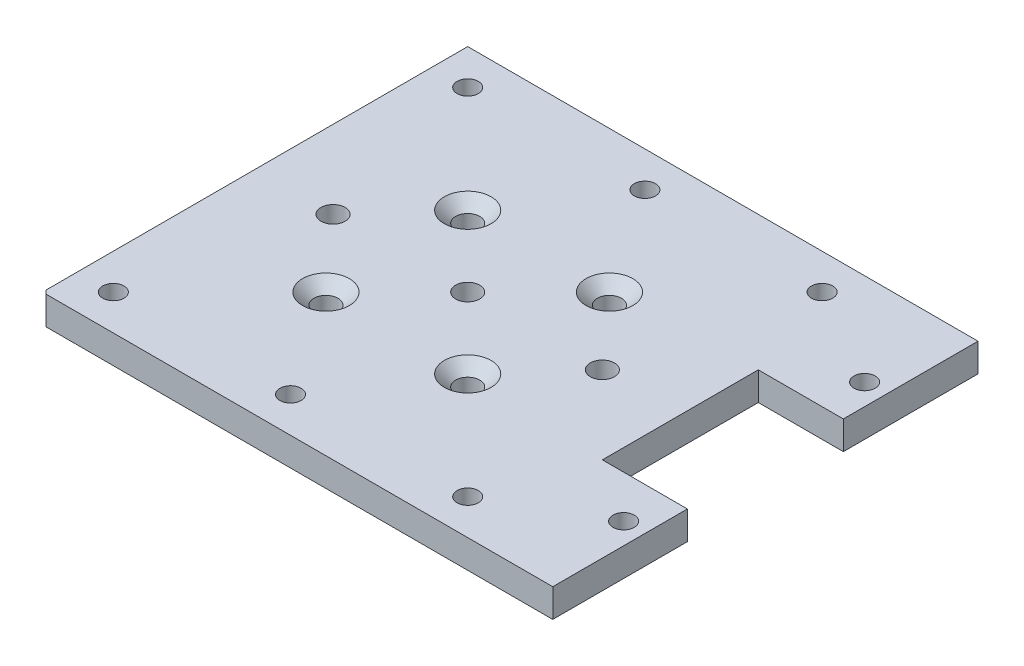
ISO-10303-21;
HEADER;
FILE_DESCRIPTION(('STEP AP214'),'2;1');
FILE_NAME('part.step','',(''),(''),'','','');
FILE_SCHEMA(('AUTOMOTIVE_DESIGN { 1 0 10303 214 1 1 1 1 }'));
ENDSEC;
DATA;
#1=APPLICATION_CONTEXT('core data for automotive mechanical design processes');
#2=APPLICATION_PROTOCOL_DEFINITION('international standard','automotive_design',2000,#1);
#3=PRODUCT_CONTEXT('',#1,'mechanical');
#4=PRODUCT('Part','Part','',(#3));
#5=PRODUCT_RELATED_PRODUCT_CATEGORY('part','',(#4));
#6=PRODUCT_DEFINITION_FORMATION('','',#4);
#7=PRODUCT_DEFINITION_CONTEXT('part definition',#1,'design');
#8=PRODUCT_DEFINITION('design','',#6,#7);
#9=PRODUCT_DEFINITION_SHAPE('','',#8);
#10=(LENGTH_UNIT() NAMED_UNIT(*) SI_UNIT(.MILLI.,.METRE.));
#11=(NAMED_UNIT(*) PLANE_ANGLE_UNIT() SI_UNIT($,.RADIAN.));
#12=(NAMED_UNIT(*) SI_UNIT($,.STERADIAN.) SOLID_ANGLE_UNIT());
#13=UNCERTAINTY_MEASURE_WITH_UNIT(LENGTH_MEASURE(1.E-05),#10,'distance_accuracy_value','');
#14=(GEOMETRIC_REPRESENTATION_CONTEXT(3) GLOBAL_UNCERTAINTY_ASSIGNED_CONTEXT((#13)) GLOBAL_UNIT_ASSIGNED_CONTEXT((#10,
#11,#12)) REPRESENTATION_CONTEXT('',''));
#15=CARTESIAN_POINT('',(0.,0.,0.));
#16=DIRECTION('',(0.,0.,1.));
#17=DIRECTION('',(1.,0.,0.));
#18=AXIS2_PLACEMENT_3D('',#15,#16,#17);
#19=CARTESIAN_POINT('',(30.,4.,30.));
#20=DIRECTION('',(-1.,0.,0.));
#21=DIRECTION('',(0.,0.,1.));
#22=AXIS2_PLACEMENT_3D('',#19,#20,#21);
#23=PLANE('',#22);
#24=DIRECTION('',(0.,1.,0.));
#25=VECTOR('',#24,1.);
#26=CARTESIAN_POINT('',(30.,-22.4722050542442,-11.));
#27=LINE('',#26,#25);
#28=CARTESIAN_POINT('',(30.,0.,-11.));
#29=VERTEX_POINT('',#28);
#30=CARTESIAN_POINT('',(30.,4.,-11.));
#31=VERTEX_POINT('',#30);
#32=EDGE_CURVE('E57',#29,#31,#27,.T.);
#33=ORIENTED_EDGE('',*,*,#32,.T.);
#34=DIRECTION('',(0.,0.,-1.));
#35=VECTOR('',#34,1.);
#36=CARTESIAN_POINT('',(30.,4.,30.));
#37=LINE('',#36,#35);
#38=CARTESIAN_POINT('',(30.,4.,11.));
#39=VERTEX_POINT('',#38);
#40=EDGE_CURVE('E133',#39,#31,#37,.T.);
#41=ORIENTED_EDGE('',*,*,#40,.F.);
#42=DIRECTION('',(0.,1.,0.));
#43=VECTOR('',#42,1.);
#44=CARTESIAN_POINT('',(30.,-22.4722050542442,11.));
#45=LINE('',#44,#43);
#46=CARTESIAN_POINT('',(30.,0.,11.));
#47=VERTEX_POINT('',#46);
#48=EDGE_CURVE('E162',#47,#39,#45,.T.);
#49=ORIENTED_EDGE('',*,*,#48,.F.);
#50=DIRECTION('',(0.,0.,-1.));
#51=VECTOR('',#50,1.);
#52=CARTESIAN_POINT('',(30.,0.,30.));
#53=LINE('',#52,#51);
#54=EDGE_CURVE('E62',#47,#29,#53,.T.);
#55=ORIENTED_EDGE('',*,*,#54,.T.);
#56=EDGE_LOOP('',(#33,#41,#49,#55));
#57=FACE_BOUND('',#56,.T.);
#58=ADVANCED_FACE('F41',(#57),#23,.F.);
#59=CARTESIAN_POINT('',(-30.,4.,-30.));
#60=DIRECTION('',(0.,0.,1.));
#61=DIRECTION('',(1.,0.,0.));
#62=AXIS2_PLACEMENT_3D('',#59,#60,#61);
#63=PLANE('',#62);
#64=DIRECTION('',(-1.,0.,0.));
#65=VECTOR('',#64,1.);
#66=CARTESIAN_POINT('',(-30.,0.,-30.));
#67=LINE('',#66,#65);
#68=CARTESIAN_POINT('',(42.,0.,-30.));
#69=VERTEX_POINT('',#68);
#70=CARTESIAN_POINT('',(-30.,0.,-30.));
#71=VERTEX_POINT('',#70);
#72=EDGE_CURVE('E280',#69,#71,#67,.T.);
#73=ORIENTED_EDGE('',*,*,#72,.T.);
#74=DIRECTION('',(0.,-1.,0.));
#75=VECTOR('',#74,1.);
#76=CARTESIAN_POINT('',(-30.,4.,-30.));
#77=LINE('',#76,#75);
#78=CARTESIAN_POINT('',(-30.,4.,-30.));
#79=VERTEX_POINT('',#78);
#80=EDGE_CURVE('E278',#79,#71,#77,.T.);
#81=ORIENTED_EDGE('',*,*,#80,.F.);
#82=DIRECTION('',(-1.,0.,0.));
#83=VECTOR('',#82,1.);
#84=CARTESIAN_POINT('',(-30.,4.,-30.));
#85=LINE('',#84,#83);
#86=CARTESIAN_POINT('',(42.,4.,-30.));
#87=VERTEX_POINT('',#86);
#88=EDGE_CURVE('E271',#87,#79,#85,.T.);
#89=ORIENTED_EDGE('',*,*,#88,.F.);
#90=DIRECTION('',(0.,1.,0.));
#91=VECTOR('',#90,1.);
#92=CARTESIAN_POINT('',(42.,-22.4722050542442,-30.));
#93=LINE('',#92,#91);
#94=EDGE_CURVE('E120',#69,#87,#93,.T.);
#95=ORIENTED_EDGE('',*,*,#94,.F.);
#96=EDGE_LOOP('',(#73,#81,#89,#95));
#97=FACE_BOUND('',#96,.T.);
#98=ADVANCED_FACE('F319',(#97),#63,.F.);
#99=CARTESIAN_POINT('',(-30.,4.,30.));
#100=DIRECTION('',(1.,0.,0.));
#101=DIRECTION('',(0.,0.,-1.));
#102=AXIS2_PLACEMENT_3D('',#99,#100,#101);
#103=PLANE('',#102);
#104=DIRECTION('',(0.,0.,1.));
#105=VECTOR('',#104,1.);
#106=CARTESIAN_POINT('',(-30.,0.,30.));
#107=LINE('',#106,#105);
#108=CARTESIAN_POINT('',(-30.,0.,29.5));
#109=VERTEX_POINT('',#108);
#110=EDGE_CURVE('E282',#71,#109,#107,.T.);
#111=ORIENTED_EDGE('',*,*,#110,.T.);
#112=DIRECTION('',(0.,1.,0.));
#113=VECTOR('',#112,1.);
#114=CARTESIAN_POINT('',(-30.,4.,29.5));
#115=LINE('',#114,#113);
#116=CARTESIAN_POINT('',(-30.,4.,29.5));
#117=VERTEX_POINT('',#116);
#118=EDGE_CURVE('E50',#109,#117,#115,.T.);
#119=ORIENTED_EDGE('',*,*,#118,.T.);
#120=DIRECTION('',(0.,0.,1.));
#121=VECTOR('',#120,1.);
#122=CARTESIAN_POINT('',(-30.,4.,30.));
#123=LINE('',#122,#121);
#124=EDGE_CURVE('E274',#79,#117,#123,.T.);
#125=ORIENTED_EDGE('',*,*,#124,.F.);
#126=ORIENTED_EDGE('',*,*,#80,.T.);
#127=EDGE_LOOP('',(#111,#119,#125,#126));
#128=FACE_BOUND('',#127,.T.);
#129=ADVANCED_FACE('F295',(#128),#103,.F.);
#130=CARTESIAN_POINT('',(-30.,4.,30.));
#131=DIRECTION('',(0.,0.,-1.));
#132=DIRECTION('',(-1.,0.,0.));
#133=AXIS2_PLACEMENT_3D('',#130,#131,#132);
#134=PLANE('',#133);
#135=DIRECTION('',(1.,0.,0.));
#136=VECTOR('',#135,1.);
#137=CARTESIAN_POINT('',(-30.,4.,30.));
#138=LINE('',#137,#136);
#139=CARTESIAN_POINT('',(-29.5,4.,30.));
#140=VERTEX_POINT('',#139);
#141=CARTESIAN_POINT('',(42.,4.,30.));
#142=VERTEX_POINT('',#141);
#143=EDGE_CURVE('E276',#140,#142,#138,.T.);
#144=ORIENTED_EDGE('',*,*,#143,.F.);
#145=DIRECTION('',(0.,-1.,0.));
#146=VECTOR('',#145,1.);
#147=CARTESIAN_POINT('',(-29.5,4.,30.));
#148=LINE('',#147,#146);
#149=CARTESIAN_POINT('',(-29.5,0.,30.));
#150=VERTEX_POINT('',#149);
#151=EDGE_CURVE('E288',#140,#150,#148,.T.);
#152=ORIENTED_EDGE('',*,*,#151,.T.);
#153=DIRECTION('',(1.,0.,0.));
#154=VECTOR('',#153,1.);
#155=CARTESIAN_POINT('',(-30.,0.,30.));
#156=LINE('',#155,#154);
#157=CARTESIAN_POINT('',(42.,0.,30.));
#158=VERTEX_POINT('',#157);
#159=EDGE_CURVE('E272',#150,#158,#156,.T.);
#160=ORIENTED_EDGE('',*,*,#159,.T.);
#161=DIRECTION('',(0.,1.,0.));
#162=VECTOR('',#161,1.);
#163=CARTESIAN_POINT('',(42.,-22.4722050542442,30.));
#164=LINE('',#163,#162);
#165=EDGE_CURVE('E156',#158,#142,#164,.T.);
#166=ORIENTED_EDGE('',*,*,#165,.T.);
#167=EDGE_LOOP('',(#144,#152,#160,#166));
#168=FACE_BOUND('',#167,.T.);
#169=ADVANCED_FACE('F304',(#168),#134,.F.);
#170=CARTESIAN_POINT('',(0.,4.,0.));
#171=DIRECTION('',(0.,-1.,0.));
#172=DIRECTION('',(0.,0.,-1.));
#173=AXIS2_PLACEMENT_3D('',#170,#171,#172);
#174=PLANE('',#173);
#175=CARTESIAN_POINT('',(25.,4.,-25.));
#176=DIRECTION('',(0.,1.,0.));
#177=DIRECTION('',(0.,0.,1.));
#178=AXIS2_PLACEMENT_3D('',#175,#176,#177);
#179=CIRCLE('',#178,1.50000000000001);
#180=CARTESIAN_POINT('',(25.,4.,-23.5));
#181=VERTEX_POINT('',#180);
#182=EDGE_CURVE('E159',#181,#181,#179,.T.);
#183=ORIENTED_EDGE('',*,*,#182,.F.);
#184=EDGE_LOOP('',(#183));
#185=FACE_BOUND('',#184,.T.);
#186=CARTESIAN_POINT('',(25.,4.,25.));
#187=DIRECTION('',(0.,1.,0.));
#188=DIRECTION('',(0.,0.,1.));
#189=AXIS2_PLACEMENT_3D('',#186,#187,#188);
#190=CIRCLE('',#189,1.50000000000001);
#191=CARTESIAN_POINT('',(25.,4.,26.5));
#192=VERTEX_POINT('',#191);
#193=EDGE_CURVE('E177',#192,#192,#190,.T.);
#194=ORIENTED_EDGE('',*,*,#193,.F.);
#195=EDGE_LOOP('',(#194));
#196=FACE_BOUND('',#195,.T.);
#197=CARTESIAN_POINT('',(0.,4.,25.));
#198=DIRECTION('',(0.,1.,0.));
#199=DIRECTION('',(0.,0.,1.));
#200=AXIS2_PLACEMENT_3D('',#197,#198,#199);
#201=CIRCLE('',#200,1.50000000000001);
#202=CARTESIAN_POINT('',(0.,4.,26.5));
#203=VERTEX_POINT('',#202);
#204=EDGE_CURVE('E183',#203,#203,#201,.T.);
#205=ORIENTED_EDGE('',*,*,#204,.F.);
#206=EDGE_LOOP('',(#205));
#207=FACE_BOUND('',#206,.T.);
#208=CARTESIAN_POINT('',(-25.,4.,25.));
#209=DIRECTION('',(0.,1.,0.));
#210=DIRECTION('',(0.,0.,1.));
#211=AXIS2_PLACEMENT_3D('',#208,#209,#210);
#212=CIRCLE('',#211,1.50000000000001);
#213=CARTESIAN_POINT('',(-25.,4.,26.5));
#214=VERTEX_POINT('',#213);
#215=EDGE_CURVE('E189',#214,#214,#212,.T.);
#216=ORIENTED_EDGE('',*,*,#215,.F.);
#217=EDGE_LOOP('',(#216));
#218=FACE_BOUND('',#217,.T.);
#219=CARTESIAN_POINT('',(-25.,4.,-25.));
#220=DIRECTION('',(0.,1.,0.));
#221=DIRECTION('',(0.,0.,1.));
#222=AXIS2_PLACEMENT_3D('',#219,#220,#221);
#223=CIRCLE('',#222,1.50000000000001);
#224=CARTESIAN_POINT('',(-25.,4.,-23.5));
#225=VERTEX_POINT('',#224);
#226=EDGE_CURVE('E195',#225,#225,#223,.T.);
#227=ORIENTED_EDGE('',*,*,#226,.F.);
#228=EDGE_LOOP('',(#227));
#229=FACE_BOUND('',#228,.T.);
#230=CARTESIAN_POINT('',(0.,4.,-25.));
#231=DIRECTION('',(0.,1.,0.));
#232=DIRECTION('',(0.,0.,1.));
#233=AXIS2_PLACEMENT_3D('',#230,#231,#232);
#234=CIRCLE('',#233,1.50000000000001);
#235=CARTESIAN_POINT('',(0.,4.,-23.5));
#236=VERTEX_POINT('',#235);
#237=EDGE_CURVE('E201',#236,#236,#234,.T.);
#238=ORIENTED_EDGE('',*,*,#237,.F.);
#239=EDGE_LOOP('',(#238));
#240=FACE_BOUND('',#239,.T.);
#241=CARTESIAN_POINT('',(-19.,4.,0.));
#242=DIRECTION('',(0.,-1.,0.));
#243=DIRECTION('',(0.,0.,-1.));
#244=AXIS2_PLACEMENT_3D('',#241,#242,#243);
#245=CIRCLE('',#244,1.7);
#246=CARTESIAN_POINT('',(-19.,4.,-1.7));
#247=VERTEX_POINT('',#246);
#248=EDGE_CURVE('E213',#247,#247,#245,.T.);
#249=ORIENTED_EDGE('',*,*,#248,.T.);
#250=EDGE_LOOP('',(#249));
#251=FACE_BOUND('',#250,.T.);
#252=CARTESIAN_POINT('',(0.,4.,0.));
#253=DIRECTION('',(0.,-1.,0.));
#254=DIRECTION('',(0.,0.,-1.));
#255=AXIS2_PLACEMENT_3D('',#252,#253,#254);
#256=CIRCLE('',#255,1.7);
#257=CARTESIAN_POINT('',(0.,4.,-1.7));
#258=VERTEX_POINT('',#257);
#259=EDGE_CURVE('E222',#258,#258,#256,.T.);
#260=ORIENTED_EDGE('',*,*,#259,.T.);
#261=EDGE_LOOP('',(#260));
#262=FACE_BOUND('',#261,.T.);
#263=CARTESIAN_POINT('',(19.,4.,0.));
#264=DIRECTION('',(0.,-1.,0.));
#265=DIRECTION('',(0.,0.,-1.));
#266=AXIS2_PLACEMENT_3D('',#263,#264,#265);
#267=CIRCLE('',#266,1.7);
#268=CARTESIAN_POINT('',(19.,4.,-1.7));
#269=VERTEX_POINT('',#268);
#270=EDGE_CURVE('E231',#269,#269,#267,.T.);
#271=ORIENTED_EDGE('',*,*,#270,.T.);
#272=EDGE_LOOP('',(#271));
#273=FACE_BOUND('',#272,.T.);
#274=CARTESIAN_POINT('',(-10.,4.,-10.));
#275=DIRECTION('',(0.,1.,0.));
#276=DIRECTION('',(0.,0.,1.));
#277=AXIS2_PLACEMENT_3D('',#274,#275,#276);
#278=CIRCLE('',#277,3.3);
#279=CARTESIAN_POINT('',(-10.,4.,-6.7));
#280=VERTEX_POINT('',#279);
#281=EDGE_CURVE('E234',#280,#280,#278,.T.);
#282=ORIENTED_EDGE('',*,*,#281,.F.);
#283=EDGE_LOOP('',(#282));
#284=FACE_BOUND('',#283,.T.);
#285=CARTESIAN_POINT('',(10.,4.,-10.0000000000006));
#286=DIRECTION('',(0.,1.,0.));
#287=DIRECTION('',(0.,0.,1.));
#288=AXIS2_PLACEMENT_3D('',#285,#286,#287);
#289=CIRCLE('',#288,3.3);
#290=CARTESIAN_POINT('',(10.,4.,-6.70000000000057));
#291=VERTEX_POINT('',#290);
#292=EDGE_CURVE('E243',#291,#291,#289,.T.);
#293=ORIENTED_EDGE('',*,*,#292,.F.);
#294=EDGE_LOOP('',(#293));
#295=FACE_BOUND('',#294,.T.);
#296=CARTESIAN_POINT('',(10.0000000000006,4.,9.99999999999944));
#297=DIRECTION('',(0.,1.,0.));
#298=DIRECTION('',(0.,0.,1.));
#299=AXIS2_PLACEMENT_3D('',#296,#297,#298);
#300=CIRCLE('',#299,3.3);
#301=CARTESIAN_POINT('',(10.0000000000006,4.,13.2999999999994));
#302=VERTEX_POINT('',#301);
#303=EDGE_CURVE('E252',#302,#302,#300,.T.);
#304=ORIENTED_EDGE('',*,*,#303,.F.);
#305=EDGE_LOOP('',(#304));
#306=FACE_BOUND('',#305,.T.);
#307=CARTESIAN_POINT('',(-9.99999999999944,4.,10.));
#308=DIRECTION('',(0.,1.,0.));
#309=DIRECTION('',(0.,0.,1.));
#310=AXIS2_PLACEMENT_3D('',#307,#308,#309);
#311=CIRCLE('',#310,3.3);
#312=CARTESIAN_POINT('',(-9.99999999999944,4.,13.3));
#313=VERTEX_POINT('',#312);
#314=EDGE_CURVE('E261',#313,#313,#311,.T.);
#315=ORIENTED_EDGE('',*,*,#314,.F.);
#316=EDGE_LOOP('',(#315));
#317=FACE_BOUND('',#316,.T.);
#318=ORIENTED_EDGE('',*,*,#124,.T.);
#319=DIRECTION('',(-0.707106781186548,0.,-0.707106781186548));
#320=VECTOR('',#319,1.);
#321=CARTESIAN_POINT('',(-29.5,4.,30.));
#322=LINE('',#321,#320);
#323=EDGE_CURVE('E11',#117,#140,#322,.F.);
#324=ORIENTED_EDGE('',*,*,#323,.T.);
#325=ORIENTED_EDGE('',*,*,#143,.T.);
#326=DIRECTION('',(0.,0.,-1.));
#327=VECTOR('',#326,1.);
#328=CARTESIAN_POINT('',(42.,4.,30.));
#329=LINE('',#328,#327);
#330=CARTESIAN_POINT('',(42.,4.,11.));
#331=VERTEX_POINT('',#330);
#332=EDGE_CURVE('E150',#142,#331,#329,.T.);
#333=ORIENTED_EDGE('',*,*,#332,.T.);
#334=DIRECTION('',(-1.,0.,0.));
#335=VECTOR('',#334,1.);
#336=CARTESIAN_POINT('',(30.,4.,11.));
#337=LINE('',#336,#335);
#338=EDGE_CURVE('E147',#331,#39,#337,.T.);
#339=ORIENTED_EDGE('',*,*,#338,.T.);
#340=ORIENTED_EDGE('',*,*,#40,.T.);
#341=DIRECTION('',(-1.,0.,0.));
#342=VECTOR('',#341,1.);
#343=CARTESIAN_POINT('',(30.,4.,-11.));
#344=LINE('',#343,#342);
#345=CARTESIAN_POINT('',(42.,4.,-11.));
#346=VERTEX_POINT('',#345);
#347=EDGE_CURVE('E114',#346,#31,#344,.T.);
#348=ORIENTED_EDGE('',*,*,#347,.F.);
#349=DIRECTION('',(0.,0.,1.));
#350=VECTOR('',#349,1.);
#351=CARTESIAN_POINT('',(42.,4.,-30.));
#352=LINE('',#351,#350);
#353=EDGE_CURVE('E124',#87,#346,#352,.T.);
#354=ORIENTED_EDGE('',*,*,#353,.F.);
#355=ORIENTED_EDGE('',*,*,#88,.T.);
#356=EDGE_LOOP('',(#318,#324,#325,#333,#339,#340,#348,#354,#355));
#357=FACE_BOUND('',#356,.T.);
#358=CARTESIAN_POINT('',(39.,4.,17.));
#359=DIRECTION('',(0.,1.,0.));
#360=DIRECTION('',(0.,0.,1.));
#361=AXIS2_PLACEMENT_3D('',#358,#359,#360);
#362=CIRCLE('',#361,1.5);
#363=CARTESIAN_POINT('',(39.,4.,18.5));
#364=VERTEX_POINT('',#363);
#365=EDGE_CURVE('E153',#364,#364,#362,.T.);
#366=ORIENTED_EDGE('',*,*,#365,.F.);
#367=EDGE_LOOP('',(#366));
#368=FACE_BOUND('',#367,.T.);
#369=CARTESIAN_POINT('',(39.,4.,-17.));
#370=DIRECTION('',(0.,-1.,0.));
#371=DIRECTION('',(0.,0.,-1.));
#372=AXIS2_PLACEMENT_3D('',#369,#370,#371);
#373=CIRCLE('',#372,1.5);
#374=CARTESIAN_POINT('',(39.,4.,-18.5));
#375=VERTEX_POINT('',#374);
#376=EDGE_CURVE('E134',#375,#375,#373,.T.);
#377=ORIENTED_EDGE('',*,*,#376,.T.);
#378=EDGE_LOOP('',(#377));
#379=FACE_BOUND('',#378,.T.);
#380=ADVANCED_FACE('F130',(#185,#196,#207,#218,#229,#240,#251,#262,#273,#284,#295,#306,#317,
#357,#368,#379),#174,.F.);
#381=CARTESIAN_POINT('',(0.,0.,0.));
#382=DIRECTION('',(0.,-1.,0.));
#383=DIRECTION('',(0.,0.,-1.));
#384=AXIS2_PLACEMENT_3D('',#381,#382,#383);
#385=PLANE('',#384);
#386=CARTESIAN_POINT('',(25.,0.,-25.));
#387=DIRECTION('',(0.,1.,0.));
#388=DIRECTION('',(0.,0.,1.));
#389=AXIS2_PLACEMENT_3D('',#386,#387,#388);
#390=CIRCLE('',#389,1.50000000000001);
#391=CARTESIAN_POINT('',(25.,0.,-23.5));
#392=VERTEX_POINT('',#391);
#393=EDGE_CURVE('E174',#392,#392,#390,.T.);
#394=ORIENTED_EDGE('',*,*,#393,.T.);
#395=EDGE_LOOP('',(#394));
#396=FACE_BOUND('',#395,.T.);
#397=CARTESIAN_POINT('',(25.,0.,25.));
#398=DIRECTION('',(0.,1.,0.));
#399=DIRECTION('',(0.,0.,1.));
#400=AXIS2_PLACEMENT_3D('',#397,#398,#399);
#401=CIRCLE('',#400,1.50000000000001);
#402=CARTESIAN_POINT('',(25.,0.,26.5));
#403=VERTEX_POINT('',#402);
#404=EDGE_CURVE('E180',#403,#403,#401,.T.);
#405=ORIENTED_EDGE('',*,*,#404,.T.);
#406=EDGE_LOOP('',(#405));
#407=FACE_BOUND('',#406,.T.);
#408=CARTESIAN_POINT('',(0.,0.,25.));
#409=DIRECTION('',(0.,1.,0.));
#410=DIRECTION('',(0.,0.,1.));
#411=AXIS2_PLACEMENT_3D('',#408,#409,#410);
#412=CIRCLE('',#411,1.50000000000001);
#413=CARTESIAN_POINT('',(0.,0.,26.5));
#414=VERTEX_POINT('',#413);
#415=EDGE_CURVE('E186',#414,#414,#412,.T.);
#416=ORIENTED_EDGE('',*,*,#415,.T.);
#417=EDGE_LOOP('',(#416));
#418=FACE_BOUND('',#417,.T.);
#419=CARTESIAN_POINT('',(-25.,0.,25.));
#420=DIRECTION('',(0.,1.,0.));
#421=DIRECTION('',(0.,0.,1.));
#422=AXIS2_PLACEMENT_3D('',#419,#420,#421);
#423=CIRCLE('',#422,1.50000000000001);
#424=CARTESIAN_POINT('',(-25.,0.,26.5));
#425=VERTEX_POINT('',#424);
#426=EDGE_CURVE('E192',#425,#425,#423,.T.);
#427=ORIENTED_EDGE('',*,*,#426,.T.);
#428=EDGE_LOOP('',(#427));
#429=FACE_BOUND('',#428,.T.);
#430=CARTESIAN_POINT('',(-25.,0.,-25.));
#431=DIRECTION('',(0.,1.,0.));
#432=DIRECTION('',(0.,0.,1.));
#433=AXIS2_PLACEMENT_3D('',#430,#431,#432);
#434=CIRCLE('',#433,1.50000000000001);
#435=CARTESIAN_POINT('',(-25.,0.,-23.5));
#436=VERTEX_POINT('',#435);
#437=EDGE_CURVE('E198',#436,#436,#434,.T.);
#438=ORIENTED_EDGE('',*,*,#437,.T.);
#439=EDGE_LOOP('',(#438));
#440=FACE_BOUND('',#439,.T.);
#441=CARTESIAN_POINT('',(0.,0.,-25.));
#442=DIRECTION('',(0.,1.,0.));
#443=DIRECTION('',(0.,0.,1.));
#444=AXIS2_PLACEMENT_3D('',#441,#442,#443);
#445=CIRCLE('',#444,1.50000000000001);
#446=CARTESIAN_POINT('',(0.,0.,-23.5));
#447=VERTEX_POINT('',#446);
#448=EDGE_CURVE('E204',#447,#447,#445,.T.);
#449=ORIENTED_EDGE('',*,*,#448,.T.);
#450=EDGE_LOOP('',(#449));
#451=FACE_BOUND('',#450,.T.);
#452=CARTESIAN_POINT('',(-19.,0.,0.));
#453=DIRECTION('',(0.,-1.,0.));
#454=DIRECTION('',(0.,0.,-1.));
#455=AXIS2_PLACEMENT_3D('',#452,#453,#454);
#456=CIRCLE('',#455,3.3);
#457=CARTESIAN_POINT('',(-19.,0.,-3.3));
#458=VERTEX_POINT('',#457);
#459=EDGE_CURVE('E207',#458,#458,#456,.T.);
#460=ORIENTED_EDGE('',*,*,#459,.F.);
#461=EDGE_LOOP('',(#460));
#462=FACE_BOUND('',#461,.T.);
#463=CARTESIAN_POINT('',(0.,0.,0.));
#464=DIRECTION('',(0.,-1.,0.));
#465=DIRECTION('',(0.,0.,-1.));
#466=AXIS2_PLACEMENT_3D('',#463,#464,#465);
#467=CIRCLE('',#466,3.3);
#468=CARTESIAN_POINT('',(0.,0.,-3.3));
#469=VERTEX_POINT('',#468);
#470=EDGE_CURVE('E216',#469,#469,#467,.T.);
#471=ORIENTED_EDGE('',*,*,#470,.F.);
#472=EDGE_LOOP('',(#471));
#473=FACE_BOUND('',#472,.T.);
#474=CARTESIAN_POINT('',(19.,0.,0.));
#475=DIRECTION('',(0.,-1.,0.));
#476=DIRECTION('',(0.,0.,-1.));
#477=AXIS2_PLACEMENT_3D('',#474,#475,#476);
#478=CIRCLE('',#477,3.3);
#479=CARTESIAN_POINT('',(19.,0.,-3.3));
#480=VERTEX_POINT('',#479);
#481=EDGE_CURVE('E225',#480,#480,#478,.T.);
#482=ORIENTED_EDGE('',*,*,#481,.F.);
#483=EDGE_LOOP('',(#482));
#484=FACE_BOUND('',#483,.T.);
#485=CARTESIAN_POINT('',(-10.,0.,-10.));
#486=DIRECTION('',(0.,1.,0.));
#487=DIRECTION('',(0.,0.,1.));
#488=AXIS2_PLACEMENT_3D('',#485,#486,#487);
#489=CIRCLE('',#488,1.7);
#490=CARTESIAN_POINT('',(-10.,0.,-8.3));
#491=VERTEX_POINT('',#490);
#492=EDGE_CURVE('E240',#491,#491,#489,.T.);
#493=ORIENTED_EDGE('',*,*,#492,.T.);
#494=EDGE_LOOP('',(#493));
#495=FACE_BOUND('',#494,.T.);
#496=CARTESIAN_POINT('',(10.,0.,-10.0000000000006));
#497=DIRECTION('',(0.,1.,0.));
#498=DIRECTION('',(0.,0.,1.));
#499=AXIS2_PLACEMENT_3D('',#496,#497,#498);
#500=CIRCLE('',#499,1.7);
#501=CARTESIAN_POINT('',(10.,0.,-8.30000000000057));
#502=VERTEX_POINT('',#501);
#503=EDGE_CURVE('E249',#502,#502,#500,.T.);
#504=ORIENTED_EDGE('',*,*,#503,.T.);
#505=EDGE_LOOP('',(#504));
#506=FACE_BOUND('',#505,.T.);
#507=CARTESIAN_POINT('',(10.0000000000006,0.,9.99999999999944));
#508=DIRECTION('',(0.,1.,0.));
#509=DIRECTION('',(0.,0.,1.));
#510=AXIS2_PLACEMENT_3D('',#507,#508,#509);
#511=CIRCLE('',#510,1.7);
#512=CARTESIAN_POINT('',(10.0000000000006,0.,11.6999999999994));
#513=VERTEX_POINT('',#512);
#514=EDGE_CURVE('E258',#513,#513,#511,.T.);
#515=ORIENTED_EDGE('',*,*,#514,.T.);
#516=EDGE_LOOP('',(#515));
#517=FACE_BOUND('',#516,.T.);
#518=CARTESIAN_POINT('',(-9.99999999999944,0.,10.));
#519=DIRECTION('',(0.,1.,0.));
#520=DIRECTION('',(0.,0.,1.));
#521=AXIS2_PLACEMENT_3D('',#518,#519,#520);
#522=CIRCLE('',#521,1.7);
#523=CARTESIAN_POINT('',(-9.99999999999944,0.,11.7));
#524=VERTEX_POINT('',#523);
#525=EDGE_CURVE('E267',#524,#524,#522,.T.);
#526=ORIENTED_EDGE('',*,*,#525,.T.);
#527=EDGE_LOOP('',(#526));
#528=FACE_BOUND('',#527,.T.);
#529=ORIENTED_EDGE('',*,*,#159,.F.);
#530=DIRECTION('',(0.707106781186548,0.,0.707106781186548));
#531=VECTOR('',#530,1.);
#532=CARTESIAN_POINT('',(-29.75,0.,29.75));
#533=LINE('',#532,#531);
#534=EDGE_CURVE('E291',#150,#109,#533,.F.);
#535=ORIENTED_EDGE('',*,*,#534,.T.);
#536=ORIENTED_EDGE('',*,*,#110,.F.);
#537=ORIENTED_EDGE('',*,*,#72,.F.);
#538=DIRECTION('',(0.,0.,1.));
#539=VECTOR('',#538,1.);
#540=CARTESIAN_POINT('',(42.,0.,-30.));
#541=LINE('',#540,#539);
#542=CARTESIAN_POINT('',(42.,0.,-11.));
#543=VERTEX_POINT('',#542);
#544=EDGE_CURVE('E137',#69,#543,#541,.T.);
#545=ORIENTED_EDGE('',*,*,#544,.T.);
#546=DIRECTION('',(-1.,0.,0.));
#547=VECTOR('',#546,1.);
#548=CARTESIAN_POINT('',(30.,0.,-11.));
#549=LINE('',#548,#547);
#550=EDGE_CURVE('E116',#543,#29,#549,.T.);
#551=ORIENTED_EDGE('',*,*,#550,.T.);
#552=ORIENTED_EDGE('',*,*,#54,.F.);
#553=DIRECTION('',(-1.,0.,0.));
#554=VECTOR('',#553,1.);
#555=CARTESIAN_POINT('',(30.,0.,11.));
#556=LINE('',#555,#554);
#557=CARTESIAN_POINT('',(42.,0.,11.));
#558=VERTEX_POINT('',#557);
#559=EDGE_CURVE('E141',#558,#47,#556,.T.);
#560=ORIENTED_EDGE('',*,*,#559,.F.);
#561=DIRECTION('',(0.,0.,-1.));
#562=VECTOR('',#561,1.);
#563=CARTESIAN_POINT('',(42.,0.,30.));
#564=LINE('',#563,#562);
#565=EDGE_CURVE('E163',#158,#558,#564,.T.);
#566=ORIENTED_EDGE('',*,*,#565,.F.);
#567=EDGE_LOOP('',(#529,#535,#536,#537,#545,#551,#552,#560,#566));
#568=FACE_BOUND('',#567,.T.);
#569=CARTESIAN_POINT('',(39.,0.,17.));
#570=DIRECTION('',(0.,-1.,0.));
#571=DIRECTION('',(0.,0.,-1.));
#572=AXIS2_PLACEMENT_3D('',#569,#570,#571);
#573=CIRCLE('',#572,1.5);
#574=CARTESIAN_POINT('',(39.,0.,15.5));
#575=VERTEX_POINT('',#574);
#576=EDGE_CURVE('E149',#575,#575,#573,.F.);
#577=ORIENTED_EDGE('',*,*,#576,.T.);
#578=EDGE_LOOP('',(#577));
#579=FACE_BOUND('',#578,.T.);
#580=CARTESIAN_POINT('',(39.,0.,-17.));
#581=DIRECTION('',(0.,-1.,0.));
#582=DIRECTION('',(0.,0.,-1.));
#583=AXIS2_PLACEMENT_3D('',#580,#581,#582);
#584=CIRCLE('',#583,1.5);
#585=CARTESIAN_POINT('',(39.,0.,-18.5));
#586=VERTEX_POINT('',#585);
#587=EDGE_CURVE('E144',#586,#586,#584,.T.);
#588=ORIENTED_EDGE('',*,*,#587,.F.);
#589=EDGE_LOOP('',(#588));
#590=FACE_BOUND('',#589,.T.);
#591=ADVANCED_FACE('F307',(#396,#407,#418,#429,#440,#451,#462,#473,#484,#495,#506,#517,#528,
#568,#579,#590),#385,.T.);
#592=CARTESIAN_POINT('',(-9.99999999999944,4.,10.));
#593=DIRECTION('',(0.,1.,0.));
#594=DIRECTION('',(0.,0.,1.));
#595=AXIS2_PLACEMENT_3D('',#592,#593,#594);
#596=CYLINDRICAL_SURFACE('',#595,1.7);
#597=ORIENTED_EDGE('',*,*,#525,.F.);
#598=EDGE_LOOP('',(#597));
#599=FACE_BOUND('',#598,.T.);
#600=CARTESIAN_POINT('',(-9.99999999999944,2.4,10.));
#601=DIRECTION('',(0.,1.,0.));
#602=DIRECTION('',(0.,0.,1.));
#603=AXIS2_PLACEMENT_3D('',#600,#601,#602);
#604=CIRCLE('',#603,1.7);
#605=CARTESIAN_POINT('',(-9.99999999999944,2.4,11.7));
#606=VERTEX_POINT('',#605);
#607=EDGE_CURVE('E264',#606,#606,#604,.T.);
#608=ORIENTED_EDGE('',*,*,#607,.T.);
#609=EDGE_LOOP('',(#608));
#610=FACE_BOUND('',#609,.T.);
#611=ADVANCED_FACE('F332',(#599,#610),#596,.F.);
#612=CARTESIAN_POINT('',(-9.99999999999944,4.,10.));
#613=DIRECTION('',(0.,1.,0.));
#614=DIRECTION('',(0.,0.,1.));
#615=AXIS2_PLACEMENT_3D('',#612,#613,#614);
#616=CONICAL_SURFACE('',#615,3.3,0.785398163397449);
#617=ORIENTED_EDGE('',*,*,#607,.F.);
#618=EDGE_LOOP('',(#617));
#619=FACE_BOUND('',#618,.T.);
#620=ORIENTED_EDGE('',*,*,#314,.T.);
#621=EDGE_LOOP('',(#620));
#622=FACE_BOUND('',#621,.T.);
#623=ADVANCED_FACE('F339',(#619,#622),#616,.F.);
#624=CARTESIAN_POINT('',(10.0000000000006,4.,9.99999999999944));
#625=DIRECTION('',(0.,1.,0.));
#626=DIRECTION('',(0.,0.,1.));
#627=AXIS2_PLACEMENT_3D('',#624,#625,#626);
#628=CYLINDRICAL_SURFACE('',#627,1.7);
#629=ORIENTED_EDGE('',*,*,#514,.F.);
#630=EDGE_LOOP('',(#629));
#631=FACE_BOUND('',#630,.T.);
#632=CARTESIAN_POINT('',(10.0000000000006,2.4,9.99999999999944));
#633=DIRECTION('',(0.,1.,0.));
#634=DIRECTION('',(0.,0.,1.));
#635=AXIS2_PLACEMENT_3D('',#632,#633,#634);
#636=CIRCLE('',#635,1.7);
#637=CARTESIAN_POINT('',(10.0000000000006,2.4,11.6999999999994));
#638=VERTEX_POINT('',#637);
#639=EDGE_CURVE('E255',#638,#638,#636,.T.);
#640=ORIENTED_EDGE('',*,*,#639,.T.);
#641=EDGE_LOOP('',(#640));
#642=FACE_BOUND('',#641,.T.);
#643=ADVANCED_FACE('F343',(#631,#642),#628,.F.);
#644=CARTESIAN_POINT('',(10.0000000000006,4.,9.99999999999944));
#645=DIRECTION('',(0.,1.,0.));
#646=DIRECTION('',(0.,0.,1.));
#647=AXIS2_PLACEMENT_3D('',#644,#645,#646);
#648=CONICAL_SURFACE('',#647,3.3,0.785398163397449);
#649=ORIENTED_EDGE('',*,*,#639,.F.);
#650=EDGE_LOOP('',(#649));
#651=FACE_BOUND('',#650,.T.);
#652=ORIENTED_EDGE('',*,*,#303,.T.);
#653=EDGE_LOOP('',(#652));
#654=FACE_BOUND('',#653,.T.);
#655=ADVANCED_FACE('F347',(#651,#654),#648,.F.);
#656=CARTESIAN_POINT('',(10.,4.,-10.0000000000006));
#657=DIRECTION('',(0.,1.,0.));
#658=DIRECTION('',(0.,0.,1.));
#659=AXIS2_PLACEMENT_3D('',#656,#657,#658);
#660=CYLINDRICAL_SURFACE('',#659,1.7);
#661=ORIENTED_EDGE('',*,*,#503,.F.);
#662=EDGE_LOOP('',(#661));
#663=FACE_BOUND('',#662,.T.);
#664=CARTESIAN_POINT('',(10.,2.4,-10.0000000000006));
#665=DIRECTION('',(0.,1.,0.));
#666=DIRECTION('',(0.,0.,1.));
#667=AXIS2_PLACEMENT_3D('',#664,#665,#666);
#668=CIRCLE('',#667,1.7);
#669=CARTESIAN_POINT('',(10.,2.4,-8.30000000000057));
#670=VERTEX_POINT('',#669);
#671=EDGE_CURVE('E246',#670,#670,#668,.T.);
#672=ORIENTED_EDGE('',*,*,#671,.T.);
#673=EDGE_LOOP('',(#672));
#674=FACE_BOUND('',#673,.T.);
#675=ADVANCED_FACE('F351',(#663,#674),#660,.F.);
#676=CARTESIAN_POINT('',(10.,4.,-10.0000000000006));
#677=DIRECTION('',(0.,1.,0.));
#678=DIRECTION('',(0.,0.,1.));
#679=AXIS2_PLACEMENT_3D('',#676,#677,#678);
#680=CONICAL_SURFACE('',#679,3.3,0.785398163397449);
#681=ORIENTED_EDGE('',*,*,#671,.F.);
#682=EDGE_LOOP('',(#681));
#683=FACE_BOUND('',#682,.T.);
#684=ORIENTED_EDGE('',*,*,#292,.T.);
#685=EDGE_LOOP('',(#684));
#686=FACE_BOUND('',#685,.T.);
#687=ADVANCED_FACE('F355',(#683,#686),#680,.F.);
#688=CARTESIAN_POINT('',(-10.,4.,-10.));
#689=DIRECTION('',(0.,1.,0.));
#690=DIRECTION('',(0.,0.,1.));
#691=AXIS2_PLACEMENT_3D('',#688,#689,#690);
#692=CYLINDRICAL_SURFACE('',#691,1.7);
#693=ORIENTED_EDGE('',*,*,#492,.F.);
#694=EDGE_LOOP('',(#693));
#695=FACE_BOUND('',#694,.T.);
#696=CARTESIAN_POINT('',(-10.,2.4,-10.));
#697=DIRECTION('',(0.,1.,0.));
#698=DIRECTION('',(0.,0.,1.));
#699=AXIS2_PLACEMENT_3D('',#696,#697,#698);
#700=CIRCLE('',#699,1.7);
#701=CARTESIAN_POINT('',(-10.,2.4,-8.3));
#702=VERTEX_POINT('',#701);
#703=EDGE_CURVE('E237',#702,#702,#700,.T.);
#704=ORIENTED_EDGE('',*,*,#703,.T.);
#705=EDGE_LOOP('',(#704));
#706=FACE_BOUND('',#705,.T.);
#707=ADVANCED_FACE('F359',(#695,#706),#692,.F.);
#708=CARTESIAN_POINT('',(-10.,4.,-10.));
#709=DIRECTION('',(0.,1.,0.));
#710=DIRECTION('',(0.,0.,1.));
#711=AXIS2_PLACEMENT_3D('',#708,#709,#710);
#712=CONICAL_SURFACE('',#711,3.3,0.785398163397449);
#713=ORIENTED_EDGE('',*,*,#703,.F.);
#714=EDGE_LOOP('',(#713));
#715=FACE_BOUND('',#714,.T.);
#716=ORIENTED_EDGE('',*,*,#281,.T.);
#717=EDGE_LOOP('',(#716));
#718=FACE_BOUND('',#717,.T.);
#719=ADVANCED_FACE('F363',(#715,#718),#712,.F.);
#720=CARTESIAN_POINT('',(19.,0.,0.));
#721=DIRECTION('',(0.,-1.,0.));
#722=DIRECTION('',(0.,0.,-1.));
#723=AXIS2_PLACEMENT_3D('',#720,#721,#722);
#724=CYLINDRICAL_SURFACE('',#723,1.7);
#725=ORIENTED_EDGE('',*,*,#270,.F.);
#726=EDGE_LOOP('',(#725));
#727=FACE_BOUND('',#726,.T.);
#728=CARTESIAN_POINT('',(19.,1.6,0.));
#729=DIRECTION('',(0.,-1.,0.));
#730=DIRECTION('',(0.,0.,-1.));
#731=AXIS2_PLACEMENT_3D('',#728,#729,#730);
#732=CIRCLE('',#731,1.7);
#733=CARTESIAN_POINT('',(19.,1.6,-1.7));
#734=VERTEX_POINT('',#733);
#735=EDGE_CURVE('E228',#734,#734,#732,.T.);
#736=ORIENTED_EDGE('',*,*,#735,.T.);
#737=EDGE_LOOP('',(#736));
#738=FACE_BOUND('',#737,.T.);
#739=ADVANCED_FACE('F367',(#727,#738),#724,.F.);
#740=CARTESIAN_POINT('',(19.,0.,0.));
#741=DIRECTION('',(0.,-1.,0.));
#742=DIRECTION('',(0.,0.,-1.));
#743=AXIS2_PLACEMENT_3D('',#740,#741,#742);
#744=CONICAL_SURFACE('',#743,3.3,0.785398163397448);
#745=ORIENTED_EDGE('',*,*,#735,.F.);
#746=EDGE_LOOP('',(#745));
#747=FACE_BOUND('',#746,.T.);
#748=ORIENTED_EDGE('',*,*,#481,.T.);
#749=EDGE_LOOP('',(#748));
#750=FACE_BOUND('',#749,.T.);
#751=ADVANCED_FACE('F371',(#747,#750),#744,.F.);
#752=CARTESIAN_POINT('',(0.,0.,0.));
#753=DIRECTION('',(0.,-1.,0.));
#754=DIRECTION('',(0.,0.,-1.));
#755=AXIS2_PLACEMENT_3D('',#752,#753,#754);
#756=CYLINDRICAL_SURFACE('',#755,1.7);
#757=ORIENTED_EDGE('',*,*,#259,.F.);
#758=EDGE_LOOP('',(#757));
#759=FACE_BOUND('',#758,.T.);
#760=CARTESIAN_POINT('',(0.,1.6,0.));
#761=DIRECTION('',(0.,-1.,0.));
#762=DIRECTION('',(0.,0.,-1.));
#763=AXIS2_PLACEMENT_3D('',#760,#761,#762);
#764=CIRCLE('',#763,1.7);
#765=CARTESIAN_POINT('',(0.,1.6,-1.7));
#766=VERTEX_POINT('',#765);
#767=EDGE_CURVE('E219',#766,#766,#764,.T.);
#768=ORIENTED_EDGE('',*,*,#767,.T.);
#769=EDGE_LOOP('',(#768));
#770=FACE_BOUND('',#769,.T.);
#771=ADVANCED_FACE('F375',(#759,#770),#756,.F.);
#772=CARTESIAN_POINT('',(0.,0.,0.));
#773=DIRECTION('',(0.,-1.,0.));
#774=DIRECTION('',(0.,0.,-1.));
#775=AXIS2_PLACEMENT_3D('',#772,#773,#774);
#776=CONICAL_SURFACE('',#775,3.3,0.785398163397448);
#777=ORIENTED_EDGE('',*,*,#767,.F.);
#778=EDGE_LOOP('',(#777));
#779=FACE_BOUND('',#778,.T.);
#780=ORIENTED_EDGE('',*,*,#470,.T.);
#781=EDGE_LOOP('',(#780));
#782=FACE_BOUND('',#781,.T.);
#783=ADVANCED_FACE('F379',(#779,#782),#776,.F.);
#784=CARTESIAN_POINT('',(-19.,0.,0.));
#785=DIRECTION('',(0.,-1.,0.));
#786=DIRECTION('',(0.,0.,-1.));
#787=AXIS2_PLACEMENT_3D('',#784,#785,#786);
#788=CYLINDRICAL_SURFACE('',#787,1.7);
#789=ORIENTED_EDGE('',*,*,#248,.F.);
#790=EDGE_LOOP('',(#789));
#791=FACE_BOUND('',#790,.T.);
#792=CARTESIAN_POINT('',(-19.,1.6,0.));
#793=DIRECTION('',(0.,-1.,0.));
#794=DIRECTION('',(0.,0.,-1.));
#795=AXIS2_PLACEMENT_3D('',#792,#793,#794);
#796=CIRCLE('',#795,1.7);
#797=CARTESIAN_POINT('',(-19.,1.6,-1.7));
#798=VERTEX_POINT('',#797);
#799=EDGE_CURVE('E210',#798,#798,#796,.T.);
#800=ORIENTED_EDGE('',*,*,#799,.T.);
#801=EDGE_LOOP('',(#800));
#802=FACE_BOUND('',#801,.T.);
#803=ADVANCED_FACE('F383',(#791,#802),#788,.F.);
#804=CARTESIAN_POINT('',(-19.,0.,0.));
#805=DIRECTION('',(0.,-1.,0.));
#806=DIRECTION('',(0.,0.,-1.));
#807=AXIS2_PLACEMENT_3D('',#804,#805,#806);
#808=CONICAL_SURFACE('',#807,3.3,0.785398163397448);
#809=ORIENTED_EDGE('',*,*,#799,.F.);
#810=EDGE_LOOP('',(#809));
#811=FACE_BOUND('',#810,.T.);
#812=ORIENTED_EDGE('',*,*,#459,.T.);
#813=EDGE_LOOP('',(#812));
#814=FACE_BOUND('',#813,.T.);
#815=ADVANCED_FACE('F387',(#811,#814),#808,.F.);
#816=CARTESIAN_POINT('',(0.,4.,-25.));
#817=DIRECTION('',(0.,1.,0.));
#818=DIRECTION('',(0.,0.,1.));
#819=AXIS2_PLACEMENT_3D('',#816,#817,#818);
#820=CYLINDRICAL_SURFACE('',#819,1.50000000000001);
#821=ORIENTED_EDGE('',*,*,#448,.F.);
#822=EDGE_LOOP('',(#821));
#823=FACE_BOUND('',#822,.T.);
#824=ORIENTED_EDGE('',*,*,#237,.T.);
#825=EDGE_LOOP('',(#824));
#826=FACE_BOUND('',#825,.T.);
#827=ADVANCED_FACE('F391',(#823,#826),#820,.F.);
#828=CARTESIAN_POINT('',(-25.,4.,-25.));
#829=DIRECTION('',(0.,1.,0.));
#830=DIRECTION('',(0.,0.,1.));
#831=AXIS2_PLACEMENT_3D('',#828,#829,#830);
#832=CYLINDRICAL_SURFACE('',#831,1.50000000000001);
#833=ORIENTED_EDGE('',*,*,#437,.F.);
#834=EDGE_LOOP('',(#833));
#835=FACE_BOUND('',#834,.T.);
#836=ORIENTED_EDGE('',*,*,#226,.T.);
#837=EDGE_LOOP('',(#836));
#838=FACE_BOUND('',#837,.T.);
#839=ADVANCED_FACE('F395',(#835,#838),#832,.F.);
#840=CARTESIAN_POINT('',(-25.,4.,25.));
#841=DIRECTION('',(0.,1.,0.));
#842=DIRECTION('',(0.,0.,1.));
#843=AXIS2_PLACEMENT_3D('',#840,#841,#842);
#844=CYLINDRICAL_SURFACE('',#843,1.50000000000001);
#845=ORIENTED_EDGE('',*,*,#426,.F.);
#846=EDGE_LOOP('',(#845));
#847=FACE_BOUND('',#846,.T.);
#848=ORIENTED_EDGE('',*,*,#215,.T.);
#849=EDGE_LOOP('',(#848));
#850=FACE_BOUND('',#849,.T.);
#851=ADVANCED_FACE('F399',(#847,#850),#844,.F.);
#852=CARTESIAN_POINT('',(0.,4.,25.));
#853=DIRECTION('',(0.,1.,0.));
#854=DIRECTION('',(0.,0.,1.));
#855=AXIS2_PLACEMENT_3D('',#852,#853,#854);
#856=CYLINDRICAL_SURFACE('',#855,1.50000000000001);
#857=ORIENTED_EDGE('',*,*,#415,.F.);
#858=EDGE_LOOP('',(#857));
#859=FACE_BOUND('',#858,.T.);
#860=ORIENTED_EDGE('',*,*,#204,.T.);
#861=EDGE_LOOP('',(#860));
#862=FACE_BOUND('',#861,.T.);
#863=ADVANCED_FACE('F403',(#859,#862),#856,.F.);
#864=CARTESIAN_POINT('',(25.,4.,25.));
#865=DIRECTION('',(0.,1.,0.));
#866=DIRECTION('',(0.,0.,1.));
#867=AXIS2_PLACEMENT_3D('',#864,#865,#866);
#868=CYLINDRICAL_SURFACE('',#867,1.50000000000001);
#869=ORIENTED_EDGE('',*,*,#404,.F.);
#870=EDGE_LOOP('',(#869));
#871=FACE_BOUND('',#870,.T.);
#872=ORIENTED_EDGE('',*,*,#193,.T.);
#873=EDGE_LOOP('',(#872));
#874=FACE_BOUND('',#873,.T.);
#875=ADVANCED_FACE('F407',(#871,#874),#868,.F.);
#876=CARTESIAN_POINT('',(25.,4.,-25.));
#877=DIRECTION('',(0.,1.,0.));
#878=DIRECTION('',(0.,0.,1.));
#879=AXIS2_PLACEMENT_3D('',#876,#877,#878);
#880=CYLINDRICAL_SURFACE('',#879,1.50000000000001);
#881=ORIENTED_EDGE('',*,*,#393,.F.);
#882=EDGE_LOOP('',(#881));
#883=FACE_BOUND('',#882,.T.);
#884=ORIENTED_EDGE('',*,*,#182,.T.);
#885=EDGE_LOOP('',(#884));
#886=FACE_BOUND('',#885,.T.);
#887=ADVANCED_FACE('F411',(#883,#886),#880,.F.);
#888=CARTESIAN_POINT('',(30.,-22.4722050542442,11.));
#889=DIRECTION('',(0.,0.,-1.));
#890=DIRECTION('',(-1.,0.,0.));
#891=AXIS2_PLACEMENT_3D('',#888,#889,#890);
#892=PLANE('',#891);
#893=DIRECTION('',(0.,1.,0.));
#894=VECTOR('',#893,1.);
#895=CARTESIAN_POINT('',(42.,-22.4722050542442,11.));
#896=LINE('',#895,#894);
#897=EDGE_CURVE('E166',#558,#331,#896,.T.);
#898=ORIENTED_EDGE('',*,*,#897,.F.);
#899=ORIENTED_EDGE('',*,*,#559,.T.);
#900=ORIENTED_EDGE('',*,*,#48,.T.);
#901=ORIENTED_EDGE('',*,*,#338,.F.);
#902=EDGE_LOOP('',(#898,#899,#900,#901));
#903=FACE_BOUND('',#902,.T.);
#904=ADVANCED_FACE('F316',(#903),#892,.T.);
#905=CARTESIAN_POINT('',(42.,-22.4722050542442,30.));
#906=DIRECTION('',(1.,0.,0.));
#907=DIRECTION('',(0.,0.,-1.));
#908=AXIS2_PLACEMENT_3D('',#905,#906,#907);
#909=PLANE('',#908);
#910=ORIENTED_EDGE('',*,*,#165,.F.);
#911=ORIENTED_EDGE('',*,*,#565,.T.);
#912=ORIENTED_EDGE('',*,*,#897,.T.);
#913=ORIENTED_EDGE('',*,*,#332,.F.);
#914=EDGE_LOOP('',(#910,#911,#912,#913));
#915=FACE_BOUND('',#914,.T.);
#916=ADVANCED_FACE('F313',(#915),#909,.T.);
#917=CARTESIAN_POINT('',(39.,-22.4722050542442,17.));
#918=DIRECTION('',(0.,1.,0.));
#919=DIRECTION('',(0.,0.,1.));
#920=AXIS2_PLACEMENT_3D('',#917,#918,#919);
#921=CYLINDRICAL_SURFACE('',#920,1.5);
#922=ORIENTED_EDGE('',*,*,#365,.T.);
#923=EDGE_LOOP('',(#922));
#924=FACE_BOUND('',#923,.T.);
#925=ORIENTED_EDGE('',*,*,#576,.F.);
#926=EDGE_LOOP('',(#925));
#927=FACE_BOUND('',#926,.T.);
#928=ADVANCED_FACE('F416',(#924,#927),#921,.F.);
#929=CARTESIAN_POINT('',(-29.5,4.,30.));
#930=DIRECTION('',(0.707106781186547,0.,-0.707106781186547));
#931=DIRECTION('',(0.,-1.,0.));
#932=AXIS2_PLACEMENT_3D('',#929,#930,#931);
#933=PLANE('',#932);
#934=ORIENTED_EDGE('',*,*,#323,.F.);
#935=ORIENTED_EDGE('',*,*,#118,.F.);
#936=ORIENTED_EDGE('',*,*,#534,.F.);
#937=ORIENTED_EDGE('',*,*,#151,.F.);
#938=EDGE_LOOP('',(#934,#935,#936,#937));
#939=FACE_BOUND('',#938,.T.);
#940=ADVANCED_FACE('F44',(#939),#933,.F.);
#941=CARTESIAN_POINT('',(30.,-22.4722050542442,-11.));
#942=DIRECTION('',(0.,0.,-1.));
#943=DIRECTION('',(-1.,0.,0.));
#944=AXIS2_PLACEMENT_3D('',#941,#942,#943);
#945=PLANE('',#944);
#946=ORIENTED_EDGE('',*,*,#550,.F.);
#947=DIRECTION('',(0.,1.,0.));
#948=VECTOR('',#947,1.);
#949=CARTESIAN_POINT('',(42.,-22.4722050542442,-11.));
#950=LINE('',#949,#948);
#951=EDGE_CURVE('E110',#543,#346,#950,.T.);
#952=ORIENTED_EDGE('',*,*,#951,.T.);
#953=ORIENTED_EDGE('',*,*,#347,.T.);
#954=ORIENTED_EDGE('',*,*,#32,.F.);
#955=EDGE_LOOP('',(#946,#952,#953,#954));
#956=FACE_BOUND('',#955,.T.);
#957=ADVANCED_FACE('F112',(#956),#945,.F.);
#958=CARTESIAN_POINT('',(42.,-22.4722050542442,-30.));
#959=DIRECTION('',(-1.,0.,0.));
#960=DIRECTION('',(0.,0.,1.));
#961=AXIS2_PLACEMENT_3D('',#958,#959,#960);
#962=PLANE('',#961);
#963=ORIENTED_EDGE('',*,*,#544,.F.);
#964=ORIENTED_EDGE('',*,*,#94,.T.);
#965=ORIENTED_EDGE('',*,*,#353,.T.);
#966=ORIENTED_EDGE('',*,*,#951,.F.);
#967=EDGE_LOOP('',(#963,#964,#965,#966));
#968=FACE_BOUND('',#967,.T.);
#969=ADVANCED_FACE('F125',(#968),#962,.F.);
#970=CARTESIAN_POINT('',(39.,-22.4722050542442,-17.));
#971=DIRECTION('',(0.,1.,0.));
#972=DIRECTION('',(0.,0.,1.));
#973=AXIS2_PLACEMENT_3D('',#970,#971,#972);
#974=CYLINDRICAL_SURFACE('',#973,1.5);
#975=ORIENTED_EDGE('',*,*,#376,.F.);
#976=EDGE_LOOP('',(#975));
#977=FACE_BOUND('',#976,.T.);
#978=ORIENTED_EDGE('',*,*,#587,.T.);
#979=EDGE_LOOP('',(#978));
#980=FACE_BOUND('',#979,.T.);
#981=ADVANCED_FACE('F428',(#977,#980),#974,.F.);
#982=CLOSED_SHELL('',(#58,#98,#129,#169,#380,#591,#611,#623,#643,#655,#675,#687,#707,#719,#739,
#751,#771,#783,#803,#815,#827,#839,#851,#863,#875,#887,#904,#916,#928,#940,#957,#969,#981));
#983=MANIFOLD_SOLID_BREP('B2',#982);
#984=ADVANCED_BREP_SHAPE_REPRESENTATION('',(#18,#983),#14);
#985=SHAPE_DEFINITION_REPRESENTATION(#9,#984);
ENDSEC;
END-ISO-10303-21;
